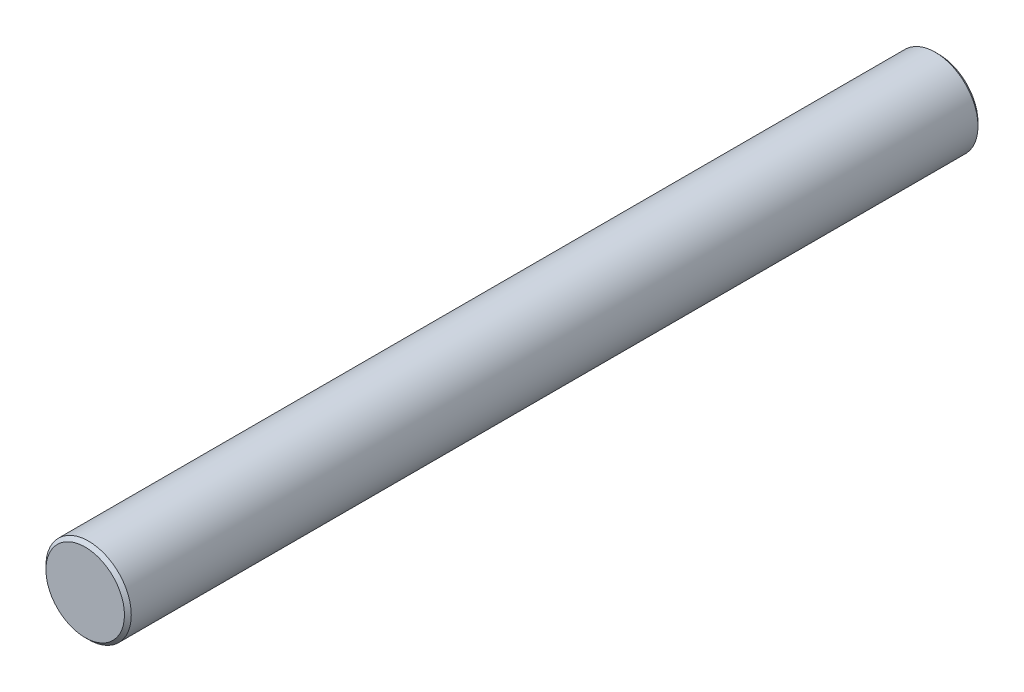
ISO-10303-21;
HEADER;
FILE_DESCRIPTION(('STEP AP214'),'2;1');
FILE_NAME('part.step','',(''),(''),'','','');
FILE_SCHEMA(('AUTOMOTIVE_DESIGN { 1 0 10303 214 1 1 1 1 }'));
ENDSEC;
DATA;
#1=APPLICATION_CONTEXT('core data for automotive mechanical design processes');
#2=APPLICATION_PROTOCOL_DEFINITION('international standard','automotive_design',2000,#1);
#3=PRODUCT_CONTEXT('',#1,'mechanical');
#4=PRODUCT('Part','Part','',(#3));
#5=PRODUCT_RELATED_PRODUCT_CATEGORY('part','',(#4));
#6=PRODUCT_DEFINITION_FORMATION('','',#4);
#7=PRODUCT_DEFINITION_CONTEXT('part definition',#1,'design');
#8=PRODUCT_DEFINITION('design','',#6,#7);
#9=PRODUCT_DEFINITION_SHAPE('','',#8);
#10=(LENGTH_UNIT() NAMED_UNIT(*) SI_UNIT(.MILLI.,.METRE.));
#11=(NAMED_UNIT(*) PLANE_ANGLE_UNIT() SI_UNIT($,.RADIAN.));
#12=(NAMED_UNIT(*) SI_UNIT($,.STERADIAN.) SOLID_ANGLE_UNIT());
#13=UNCERTAINTY_MEASURE_WITH_UNIT(LENGTH_MEASURE(1.E-05),#10,'distance_accuracy_value','');
#14=(GEOMETRIC_REPRESENTATION_CONTEXT(3) GLOBAL_UNCERTAINTY_ASSIGNED_CONTEXT((#13)) GLOBAL_UNIT_ASSIGNED_CONTEXT((#10,
#11,#12)) REPRESENTATION_CONTEXT('',''));
#15=CARTESIAN_POINT('',(0.,0.,0.));
#16=DIRECTION('',(0.,0.,1.));
#17=DIRECTION('',(1.,0.,0.));
#18=AXIS2_PLACEMENT_3D('',#15,#16,#17);
#19=CARTESIAN_POINT('',(0.,0.,100.));
#20=DIRECTION('',(0.,0.,-1.));
#21=DIRECTION('',(-1.,0.,0.));
#22=AXIS2_PLACEMENT_3D('',#19,#20,#21);
#23=CYLINDRICAL_SURFACE('',#22,5.);
#24=CARTESIAN_POINT('',(0.,0.,0.400000000000011));
#25=DIRECTION('',(0.,0.,1.));
#26=DIRECTION('',(1.,0.,0.));
#27=AXIS2_PLACEMENT_3D('',#24,#25,#26);
#28=CIRCLE('',#27,5.);
#29=CARTESIAN_POINT('',(5.,0.,0.400000000000011));
#30=VERTEX_POINT('',#29);
#31=EDGE_CURVE('E49',#30,#30,#28,.T.);
#32=ORIENTED_EDGE('',*,*,#31,.T.);
#33=EDGE_LOOP('',(#32));
#34=FACE_BOUND('',#33,.T.);
#35=CARTESIAN_POINT('',(0.,0.,99.6));
#36=DIRECTION('',(0.,0.,1.));
#37=DIRECTION('',(1.,0.,0.));
#38=AXIS2_PLACEMENT_3D('',#35,#36,#37);
#39=CIRCLE('',#38,5.);
#40=CARTESIAN_POINT('',(5.,0.,99.6));
#41=VERTEX_POINT('',#40);
#42=EDGE_CURVE('E53',#41,#41,#39,.F.);
#43=ORIENTED_EDGE('',*,*,#42,.T.);
#44=EDGE_LOOP('',(#43));
#45=FACE_BOUND('',#44,.T.);
#46=ADVANCED_FACE('F37',(#34,#45),#23,.T.);
#47=CARTESIAN_POINT('',(0.,0.,100.));
#48=DIRECTION('',(0.,0.,1.));
#49=DIRECTION('',(1.,0.,0.));
#50=AXIS2_PLACEMENT_3D('',#47,#48,#49);
#51=PLANE('',#50);
#52=CARTESIAN_POINT('',(0.,0.,100.));
#53=DIRECTION('',(0.,0.,1.));
#54=DIRECTION('',(1.,0.,0.));
#55=AXIS2_PLACEMENT_3D('',#52,#53,#54);
#56=CIRCLE('',#55,4.60000000000002);
#57=CARTESIAN_POINT('',(4.60000000000002,0.,100.));
#58=VERTEX_POINT('',#57);
#59=EDGE_CURVE('E10',#58,#58,#56,.T.);
#60=ORIENTED_EDGE('',*,*,#59,.T.);
#61=EDGE_LOOP('',(#60));
#62=FACE_BOUND('',#61,.T.);
#63=ADVANCED_FACE('F69',(#62),#51,.T.);
#64=CARTESIAN_POINT('',(0.,0.,0.));
#65=DIRECTION('',(0.,0.,1.));
#66=DIRECTION('',(1.,0.,0.));
#67=AXIS2_PLACEMENT_3D('',#64,#65,#66);
#68=PLANE('',#67);
#69=CARTESIAN_POINT('',(0.,0.,0.));
#70=DIRECTION('',(0.,0.,1.));
#71=DIRECTION('',(1.,0.,0.));
#72=AXIS2_PLACEMENT_3D('',#69,#70,#71);
#73=CIRCLE('',#72,4.59999999999999);
#74=CARTESIAN_POINT('',(4.59999999999999,0.,0.));
#75=VERTEX_POINT('',#74);
#76=EDGE_CURVE('E45',#75,#75,#73,.F.);
#77=ORIENTED_EDGE('',*,*,#76,.T.);
#78=EDGE_LOOP('',(#77));
#79=FACE_BOUND('',#78,.T.);
#80=ADVANCED_FACE('F66',(#79),#68,.F.);
#81=CARTESIAN_POINT('',(0.,0.,0.400000000000011));
#82=DIRECTION('',(0.,0.,1.));
#83=DIRECTION('',(1.,0.,0.));
#84=AXIS2_PLACEMENT_3D('',#81,#82,#83);
#85=CONICAL_SURFACE('',#84,5.,0.785398163397443);
#86=ORIENTED_EDGE('',*,*,#76,.F.);
#87=EDGE_LOOP('',(#86));
#88=FACE_BOUND('',#87,.T.);
#89=ORIENTED_EDGE('',*,*,#31,.F.);
#90=EDGE_LOOP('',(#89));
#91=FACE_BOUND('',#90,.T.);
#92=ADVANCED_FACE('F62',(#88,#91),#85,.T.);
#93=CARTESIAN_POINT('',(0.,0.,100.));
#94=DIRECTION('',(0.,0.,-1.));
#95=DIRECTION('',(-1.,0.,0.));
#96=AXIS2_PLACEMENT_3D('',#93,#94,#95);
#97=CONICAL_SURFACE('',#96,4.60000000000002,0.78539816339746);
#98=ORIENTED_EDGE('',*,*,#42,.F.);
#99=EDGE_LOOP('',(#98));
#100=FACE_BOUND('',#99,.T.);
#101=ORIENTED_EDGE('',*,*,#59,.F.);
#102=EDGE_LOOP('',(#101));
#103=FACE_BOUND('',#102,.T.);
#104=ADVANCED_FACE('F40',(#100,#103),#97,.T.);
#105=CLOSED_SHELL('',(#46,#63,#80,#92,#104));
#106=MANIFOLD_SOLID_BREP('B2',#105);
#107=ADVANCED_BREP_SHAPE_REPRESENTATION('',(#18,#106),#14);
#108=SHAPE_DEFINITION_REPRESENTATION(#9,#107);
ENDSEC;
END-ISO-10303-21;
